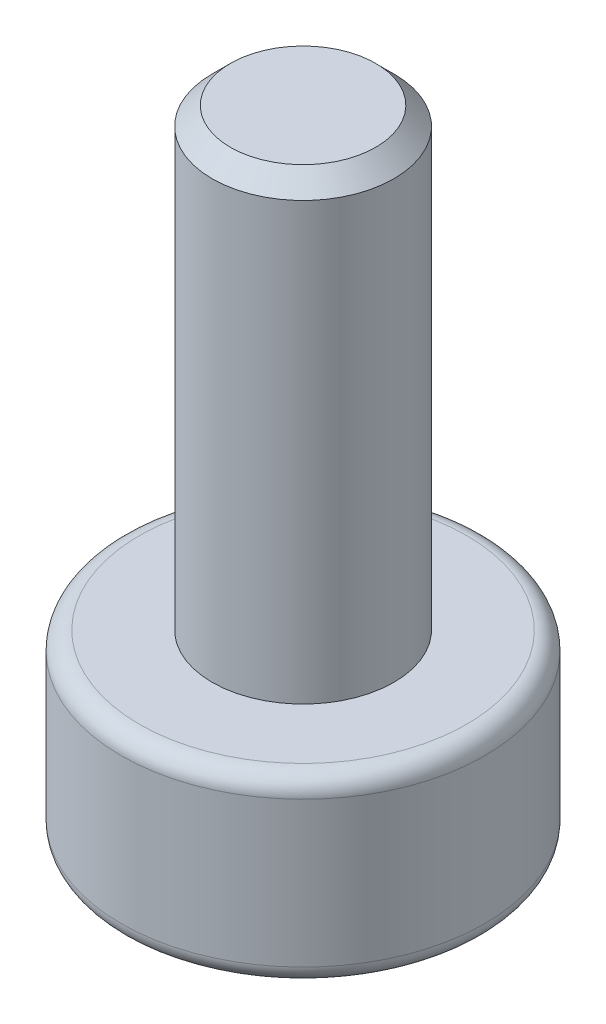
ISO-10303-21;
HEADER;
FILE_DESCRIPTION(('STEP AP214'),'2;1');
FILE_NAME('part.step','',(''),(''),'','','');
FILE_SCHEMA(('AUTOMOTIVE_DESIGN { 1 0 10303 214 1 1 1 1 }'));
ENDSEC;
DATA;
#1=APPLICATION_CONTEXT('core data for automotive mechanical design processes');
#2=APPLICATION_PROTOCOL_DEFINITION('international standard','automotive_design',2000,#1);
#3=PRODUCT_CONTEXT('',#1,'mechanical');
#4=PRODUCT('Part','Part','',(#3));
#5=PRODUCT_RELATED_PRODUCT_CATEGORY('part','',(#4));
#6=PRODUCT_DEFINITION_FORMATION('','',#4);
#7=PRODUCT_DEFINITION_CONTEXT('part definition',#1,'design');
#8=PRODUCT_DEFINITION('design','',#6,#7);
#9=PRODUCT_DEFINITION_SHAPE('','',#8);
#10=(LENGTH_UNIT() NAMED_UNIT(*) SI_UNIT(.MILLI.,.METRE.));
#11=(NAMED_UNIT(*) PLANE_ANGLE_UNIT() SI_UNIT($,.RADIAN.));
#12=(NAMED_UNIT(*) SI_UNIT($,.STERADIAN.) SOLID_ANGLE_UNIT());
#13=UNCERTAINTY_MEASURE_WITH_UNIT(LENGTH_MEASURE(1.E-05),#10,'distance_accuracy_value','');
#14=(GEOMETRIC_REPRESENTATION_CONTEXT(3) GLOBAL_UNCERTAINTY_ASSIGNED_CONTEXT((#13)) GLOBAL_UNIT_ASSIGNED_CONTEXT((#10,
#11,#12)) REPRESENTATION_CONTEXT('',''));
#15=CARTESIAN_POINT('',(0.,0.,0.));
#16=DIRECTION('',(0.,0.,1.));
#17=DIRECTION('',(1.,0.,0.));
#18=AXIS2_PLACEMENT_3D('',#15,#16,#17);
#19=CARTESIAN_POINT('',(0.,2.,0.));
#20=DIRECTION('',(0.,-1.,0.));
#21=DIRECTION('',(0.,0.,-1.));
#22=AXIS2_PLACEMENT_3D('',#19,#20,#21);
#23=CYLINDRICAL_SURFACE('',#22,2.);
#24=CARTESIAN_POINT('',(0.,0.2,0.));
#25=DIRECTION('',(0.,1.,0.));
#26=DIRECTION('',(0.,0.,1.));
#27=AXIS2_PLACEMENT_3D('',#24,#25,#26);
#28=CIRCLE('',#27,2.);
#29=CARTESIAN_POINT('',(0.,0.2,2.));
#30=VERTEX_POINT('',#29);
#31=EDGE_CURVE('E72',#30,#30,#28,.T.);
#32=ORIENTED_EDGE('',*,*,#31,.T.);
#33=EDGE_LOOP('',(#32));
#34=FACE_BOUND('',#33,.T.);
#35=CARTESIAN_POINT('',(0.,1.8,0.));
#36=DIRECTION('',(0.,1.,0.));
#37=DIRECTION('',(0.,0.,1.));
#38=AXIS2_PLACEMENT_3D('',#35,#36,#37);
#39=CIRCLE('',#38,2.);
#40=CARTESIAN_POINT('',(0.,1.8,2.));
#41=VERTEX_POINT('',#40);
#42=EDGE_CURVE('E76',#41,#41,#39,.F.);
#43=ORIENTED_EDGE('',*,*,#42,.T.);
#44=EDGE_LOOP('',(#43));
#45=FACE_BOUND('',#44,.T.);
#46=ADVANCED_FACE('F39',(#34,#45),#23,.T.);
#47=CARTESIAN_POINT('',(0.,2.,0.));
#48=DIRECTION('',(0.,1.,0.));
#49=DIRECTION('',(0.,0.,1.));
#50=AXIS2_PLACEMENT_3D('',#47,#48,#49);
#51=PLANE('',#50);
#52=CARTESIAN_POINT('',(0.,2.,0.));
#53=DIRECTION('',(0.,1.,0.));
#54=DIRECTION('',(0.,0.,1.));
#55=AXIS2_PLACEMENT_3D('',#52,#53,#54);
#56=CIRCLE('',#55,1.8);
#57=CARTESIAN_POINT('',(0.,2.,1.8));
#58=VERTEX_POINT('',#57);
#59=EDGE_CURVE('E64',#58,#58,#56,.T.);
#60=ORIENTED_EDGE('',*,*,#59,.T.);
#61=EDGE_LOOP('',(#60));
#62=FACE_BOUND('',#61,.T.);
#63=CARTESIAN_POINT('',(0.,2.,0.));
#64=DIRECTION('',(0.,1.,0.));
#65=DIRECTION('',(0.,0.,1.));
#66=AXIS2_PLACEMENT_3D('',#63,#64,#65);
#67=CIRCLE('',#66,1.);
#68=CARTESIAN_POINT('',(0.,2.,1.));
#69=VERTEX_POINT('',#68);
#70=EDGE_CURVE('E80',#69,#69,#67,.T.);
#71=ORIENTED_EDGE('',*,*,#70,.F.);
#72=EDGE_LOOP('',(#71));
#73=FACE_BOUND('',#72,.T.);
#74=ADVANCED_FACE('F107',(#62,#73),#51,.T.);
#75=CARTESIAN_POINT('',(0.,0.,0.));
#76=DIRECTION('',(0.,1.,0.));
#77=DIRECTION('',(0.,0.,1.));
#78=AXIS2_PLACEMENT_3D('',#75,#76,#77);
#79=PLANE('',#78);
#80=CARTESIAN_POINT('',(0.,0.,0.));
#81=DIRECTION('',(0.,1.,0.));
#82=DIRECTION('',(0.,0.,1.));
#83=AXIS2_PLACEMENT_3D('',#80,#81,#82);
#84=CIRCLE('',#83,0.864999999999999);
#85=CARTESIAN_POINT('',(0.,0.,0.864999999999999));
#86=VERTEX_POINT('',#85);
#87=EDGE_CURVE('E53',#86,#86,#84,.T.);
#88=ORIENTED_EDGE('',*,*,#87,.T.);
#89=EDGE_LOOP('',(#88));
#90=FACE_BOUND('',#89,.T.);
#91=CARTESIAN_POINT('',(0.,0.,0.));
#92=DIRECTION('',(0.,1.,0.));
#93=DIRECTION('',(0.,0.,1.));
#94=AXIS2_PLACEMENT_3D('',#91,#92,#93);
#95=CIRCLE('',#94,1.8);
#96=CARTESIAN_POINT('',(0.,0.,1.8));
#97=VERTEX_POINT('',#96);
#98=EDGE_CURVE('E68',#97,#97,#95,.F.);
#99=ORIENTED_EDGE('',*,*,#98,.T.);
#100=EDGE_LOOP('',(#99));
#101=FACE_BOUND('',#100,.T.);
#102=ADVANCED_FACE('F113',(#90,#101),#79,.F.);
#103=CARTESIAN_POINT('',(0.,7.,0.));
#104=DIRECTION('',(0.,-1.,0.));
#105=DIRECTION('',(0.,0.,-1.));
#106=AXIS2_PLACEMENT_3D('',#103,#104,#105);
#107=CYLINDRICAL_SURFACE('',#106,1.);
#108=CARTESIAN_POINT('',(0.,6.8,0.));
#109=DIRECTION('',(0.,1.,0.));
#110=DIRECTION('',(0.,0.,1.));
#111=AXIS2_PLACEMENT_3D('',#108,#109,#110);
#112=CIRCLE('',#111,1.);
#113=CARTESIAN_POINT('',(0.,6.8,1.));
#114=VERTEX_POINT('',#113);
#115=EDGE_CURVE('E10',#114,#114,#112,.F.);
#116=ORIENTED_EDGE('',*,*,#115,.T.);
#117=EDGE_LOOP('',(#116));
#118=FACE_BOUND('',#117,.T.);
#119=ORIENTED_EDGE('',*,*,#70,.T.);
#120=EDGE_LOOP('',(#119));
#121=FACE_BOUND('',#120,.T.);
#122=ADVANCED_FACE('F137',(#118,#121),#107,.T.);
#123=CARTESIAN_POINT('',(0.,7.,0.));
#124=DIRECTION('',(0.,1.,0.));
#125=DIRECTION('',(0.,0.,1.));
#126=AXIS2_PLACEMENT_3D('',#123,#124,#125);
#127=PLANE('',#126);
#128=CARTESIAN_POINT('',(0.,7.,0.));
#129=DIRECTION('',(0.,1.,0.));
#130=DIRECTION('',(0.,0.,1.));
#131=AXIS2_PLACEMENT_3D('',#128,#129,#130);
#132=CIRCLE('',#131,0.800000000000002);
#133=CARTESIAN_POINT('',(0.,7.,0.800000000000002));
#134=VERTEX_POINT('',#133);
#135=EDGE_CURVE('E48',#134,#134,#132,.T.);
#136=ORIENTED_EDGE('',*,*,#135,.T.);
#137=EDGE_LOOP('',(#136));
#138=FACE_BOUND('',#137,.T.);
#139=ADVANCED_FACE('F120',(#138),#127,.T.);
#140=CARTESIAN_POINT('',(0.,0.2,0.));
#141=DIRECTION('',(0.,1.,0.));
#142=DIRECTION('',(0.,0.,1.));
#143=AXIS2_PLACEMENT_3D('',#140,#141,#142);
#144=TOROIDAL_SURFACE('',#143,1.8,0.2);
#145=ORIENTED_EDGE('',*,*,#98,.F.);
#146=EDGE_LOOP('',(#145));
#147=FACE_BOUND('',#146,.T.);
#148=ORIENTED_EDGE('',*,*,#31,.F.);
#149=EDGE_LOOP('',(#148));
#150=FACE_BOUND('',#149,.T.);
#151=ADVANCED_FACE('F102',(#147,#150),#144,.T.);
#152=CARTESIAN_POINT('',(0.,1.8,0.));
#153=DIRECTION('',(0.,1.,0.));
#154=DIRECTION('',(0.,0.,1.));
#155=AXIS2_PLACEMENT_3D('',#152,#153,#154);
#156=TOROIDAL_SURFACE('',#155,1.8,0.2);
#157=ORIENTED_EDGE('',*,*,#42,.F.);
#158=EDGE_LOOP('',(#157));
#159=FACE_BOUND('',#158,.T.);
#160=ORIENTED_EDGE('',*,*,#59,.F.);
#161=EDGE_LOOP('',(#160));
#162=FACE_BOUND('',#161,.T.);
#163=ADVANCED_FACE('F93',(#159,#162),#156,.T.);
#164=CARTESIAN_POINT('',(0.,1.52,0.));
#165=DIRECTION('',(0.,-1.,0.));
#166=DIRECTION('',(0.,0.,-1.));
#167=AXIS2_PLACEMENT_3D('',#164,#165,#166);
#168=CYLINDRICAL_SURFACE('',#167,0.765);
#169=CARTESIAN_POINT('',(0.,0.0999999999999985,0.));
#170=DIRECTION('',(0.,1.,0.));
#171=DIRECTION('',(0.,0.,1.));
#172=AXIS2_PLACEMENT_3D('',#169,#170,#171);
#173=CIRCLE('',#172,0.765);
#174=CARTESIAN_POINT('',(0.,0.0999999999999985,0.765));
#175=VERTEX_POINT('',#174);
#176=EDGE_CURVE('E58',#175,#175,#173,.F.);
#177=ORIENTED_EDGE('',*,*,#176,.T.);
#178=EDGE_LOOP('',(#177));
#179=FACE_BOUND('',#178,.T.);
#180=CARTESIAN_POINT('',(0.,1.52,0.));
#181=DIRECTION('',(0.,-1.,0.));
#182=DIRECTION('',(0.,0.,-1.));
#183=AXIS2_PLACEMENT_3D('',#180,#181,#182);
#184=CIRCLE('',#183,0.765);
#185=CARTESIAN_POINT('',(0.,1.52,-0.765));
#186=VERTEX_POINT('',#185);
#187=EDGE_CURVE('E84',#186,#186,#184,.T.);
#188=ORIENTED_EDGE('',*,*,#187,.F.);
#189=EDGE_LOOP('',(#188));
#190=FACE_BOUND('',#189,.T.);
#191=ADVANCED_FACE('F91',(#179,#190),#168,.F.);
#192=CARTESIAN_POINT('',(0.,1.52,0.));
#193=DIRECTION('',(0.,-1.,0.));
#194=DIRECTION('',(0.,0.,-1.));
#195=AXIS2_PLACEMENT_3D('',#192,#193,#194);
#196=PLANE('',#195);
#197=ORIENTED_EDGE('',*,*,#187,.T.);
#198=EDGE_LOOP('',(#197));
#199=FACE_BOUND('',#198,.T.);
#200=ADVANCED_FACE('F89',(#199),#196,.T.);
#201=CARTESIAN_POINT('',(0.,0.0999999999999985,0.));
#202=DIRECTION('',(0.,-1.,0.));
#203=DIRECTION('',(0.,0.,-1.));
#204=AXIS2_PLACEMENT_3D('',#201,#202,#203);
#205=CONICAL_SURFACE('',#204,0.765,0.785398163397452);
#206=ORIENTED_EDGE('',*,*,#87,.F.);
#207=EDGE_LOOP('',(#206));
#208=FACE_BOUND('',#207,.T.);
#209=ORIENTED_EDGE('',*,*,#176,.F.);
#210=EDGE_LOOP('',(#209));
#211=FACE_BOUND('',#210,.T.);
#212=ADVANCED_FACE('F100',(#208,#211),#205,.F.);
#213=CARTESIAN_POINT('',(0.,7.,0.));
#214=DIRECTION('',(0.,-1.,0.));
#215=DIRECTION('',(0.,0.,-1.));
#216=AXIS2_PLACEMENT_3D('',#213,#214,#215);
#217=CONICAL_SURFACE('',#216,0.800000000000002,0.785398163397448);
#218=ORIENTED_EDGE('',*,*,#115,.F.);
#219=EDGE_LOOP('',(#218));
#220=FACE_BOUND('',#219,.T.);
#221=ORIENTED_EDGE('',*,*,#135,.F.);
#222=EDGE_LOOP('',(#221));
#223=FACE_BOUND('',#222,.T.);
#224=ADVANCED_FACE('F42',(#220,#223),#217,.T.);
#225=CLOSED_SHELL('',(#46,#74,#102,#122,#139,#151,#163,#191,#200,#212,#224));
#226=MANIFOLD_SOLID_BREP('B2',#225);
#227=ADVANCED_BREP_SHAPE_REPRESENTATION('',(#18,#226),#14);
#228=SHAPE_DEFINITION_REPRESENTATION(#9,#227);
ENDSEC;
END-ISO-10303-21;
